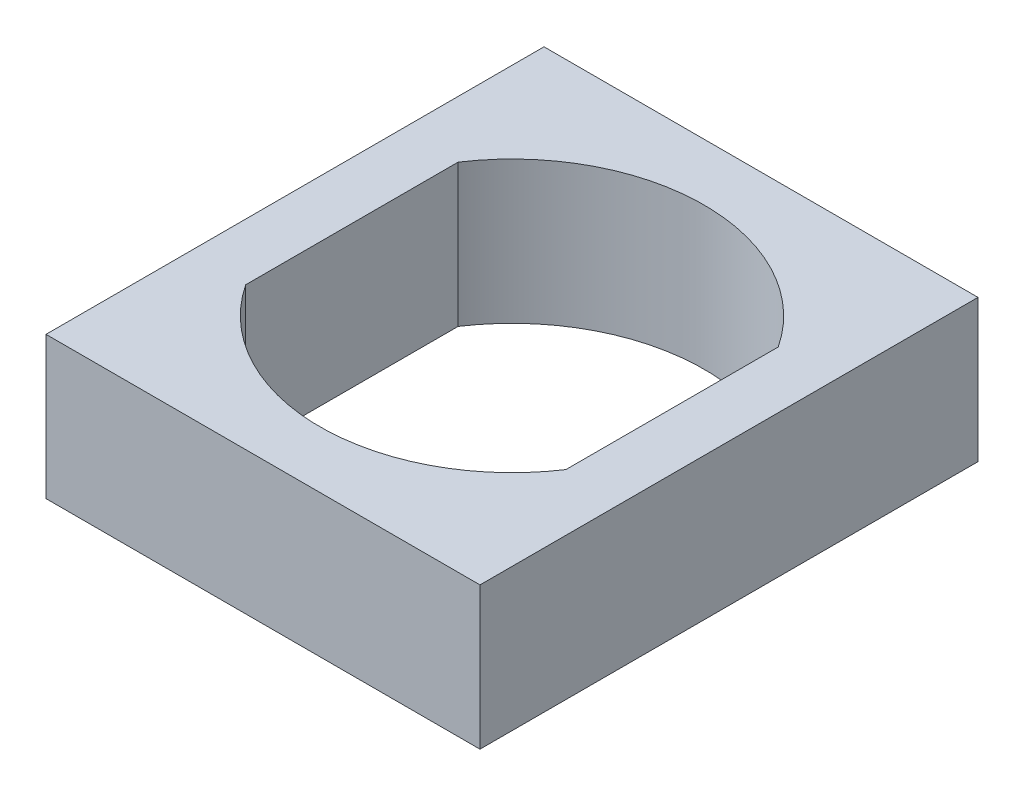
ISO-10303-21;
HEADER;
FILE_DESCRIPTION(('STEP AP214'),'2;1');
FILE_NAME('part.step','',(''),(''),'','','');
FILE_SCHEMA(('AUTOMOTIVE_DESIGN { 1 0 10303 214 1 1 1 1 }'));
ENDSEC;
DATA;
#1=APPLICATION_CONTEXT('core data for automotive mechanical design processes');
#2=APPLICATION_PROTOCOL_DEFINITION('international standard','automotive_design',2000,#1);
#3=PRODUCT_CONTEXT('',#1,'mechanical');
#4=PRODUCT('Part','Part','',(#3));
#5=PRODUCT_RELATED_PRODUCT_CATEGORY('part','',(#4));
#6=PRODUCT_DEFINITION_FORMATION('','',#4);
#7=PRODUCT_DEFINITION_CONTEXT('part definition',#1,'design');
#8=PRODUCT_DEFINITION('design','',#6,#7);
#9=PRODUCT_DEFINITION_SHAPE('','',#8);
#10=(LENGTH_UNIT() NAMED_UNIT(*) SI_UNIT(.MILLI.,.METRE.));
#11=(NAMED_UNIT(*) PLANE_ANGLE_UNIT() SI_UNIT($,.RADIAN.));
#12=(NAMED_UNIT(*) SI_UNIT($,.STERADIAN.) SOLID_ANGLE_UNIT());
#13=UNCERTAINTY_MEASURE_WITH_UNIT(LENGTH_MEASURE(1.E-05),#10,'distance_accuracy_value','');
#14=(GEOMETRIC_REPRESENTATION_CONTEXT(3) GLOBAL_UNCERTAINTY_ASSIGNED_CONTEXT((#13)) GLOBAL_UNIT_ASSIGNED_CONTEXT((#10,
#11,#12)) REPRESENTATION_CONTEXT('',''));
#15=CARTESIAN_POINT('',(0.,0.,0.));
#16=DIRECTION('',(0.,0.,1.));
#17=DIRECTION('',(1.,0.,0.));
#18=AXIS2_PLACEMENT_3D('',#15,#16,#17);
#19=CARTESIAN_POINT('',(0.,45.5089179326912,0.));
#20=DIRECTION('',(0.,-1.,0.));
#21=DIRECTION('',(0.,0.,-1.));
#22=AXIS2_PLACEMENT_3D('',#19,#20,#21);
#23=PLANE('',#22);
#24=DIRECTION('',(0.,0.,1.));
#25=VECTOR('',#24,1.);
#26=CARTESIAN_POINT('',(27.5665676653378,45.5089179326912,72.6258327334639));
#27=LINE('',#26,#25);
#28=CARTESIAN_POINT('',(27.5665676653378,45.5089179326912,65.6258327334642));
#29=VERTEX_POINT('',#28);
#30=CARTESIAN_POINT('',(27.5665676653378,45.5089179326912,72.6258327334639));
#31=VERTEX_POINT('',#30);
#32=EDGE_CURVE('E132',#29,#31,#27,.T.);
#33=ORIENTED_EDGE('',*,*,#32,.F.);
#34=DIRECTION('',(-1.,0.,0.));
#35=VECTOR('',#34,1.);
#36=CARTESIAN_POINT('',(27.5665676653378,45.5089179326912,65.6258327334642));
#37=LINE('',#36,#35);
#38=CARTESIAN_POINT('',(33.6665676653378,45.5089179326912,65.6258327334642));
#39=VERTEX_POINT('',#38);
#40=EDGE_CURVE('E102',#39,#29,#37,.T.);
#41=ORIENTED_EDGE('',*,*,#40,.F.);
#42=DIRECTION('',(0.,0.,-1.));
#43=VECTOR('',#42,1.);
#44=CARTESIAN_POINT('',(33.6665676653378,45.5089179326912,72.6258327334639));
#45=LINE('',#44,#43);
#46=CARTESIAN_POINT('',(33.6665676653378,45.5089179326912,72.6258327334639));
#47=VERTEX_POINT('',#46);
#48=EDGE_CURVE('E126',#47,#39,#45,.T.);
#49=ORIENTED_EDGE('',*,*,#48,.F.);
#50=DIRECTION('',(1.,0.,0.));
#51=VECTOR('',#50,1.);
#52=CARTESIAN_POINT('',(27.5665676653378,45.5089179326912,72.6258327334639));
#53=LINE('',#52,#51);
#54=EDGE_CURVE('E122',#31,#47,#53,.T.);
#55=ORIENTED_EDGE('',*,*,#54,.F.);
#56=EDGE_LOOP('',(#33,#41,#49,#55));
#57=FACE_BOUND('',#56,.T.);
#58=DIRECTION('',(0.,0.,1.));
#59=VECTOR('',#58,1.);
#60=CARTESIAN_POINT('',(28.3665676653378,45.5089179326912,67.6333515778041));
#61=LINE('',#60,#59);
#62=CARTESIAN_POINT('',(28.3665676653378,45.5089179326912,67.6333515778041));
#63=VERTEX_POINT('',#62);
#64=CARTESIAN_POINT('',(28.3665676653378,45.5089179326912,70.618313889124));
#65=VERTEX_POINT('',#64);
#66=EDGE_CURVE('E112',#63,#65,#61,.T.);
#67=ORIENTED_EDGE('',*,*,#66,.T.);
#68=CARTESIAN_POINT('',(30.6165676653378,45.5089179326912,69.125832733464));
#69=DIRECTION('',(0.,1.,0.));
#70=DIRECTION('',(0.,0.,1.));
#71=AXIS2_PLACEMENT_3D('',#68,#69,#70);
#72=CIRCLE('',#71,2.7);
#73=CARTESIAN_POINT('',(32.8665676653378,45.5089179326912,70.618313889124));
#74=VERTEX_POINT('',#73);
#75=EDGE_CURVE('E98',#65,#74,#72,.T.);
#76=ORIENTED_EDGE('',*,*,#75,.T.);
#77=DIRECTION('',(0.,0.,-1.));
#78=VECTOR('',#77,1.);
#79=CARTESIAN_POINT('',(32.8665676653378,45.5089179326912,67.6333515778041));
#80=LINE('',#79,#78);
#81=CARTESIAN_POINT('',(32.8665676653378,45.5089179326912,67.6333515778041));
#82=VERTEX_POINT('',#81);
#83=EDGE_CURVE('E105',#74,#82,#80,.T.);
#84=ORIENTED_EDGE('',*,*,#83,.T.);
#85=CARTESIAN_POINT('',(30.6165676653378,45.5089179326912,69.125832733464));
#86=DIRECTION('',(0.,1.,0.));
#87=DIRECTION('',(0.,0.,1.));
#88=AXIS2_PLACEMENT_3D('',#85,#86,#87);
#89=CIRCLE('',#88,2.7);
#90=EDGE_CURVE('E109',#82,#63,#89,.T.);
#91=ORIENTED_EDGE('',*,*,#90,.T.);
#92=EDGE_LOOP('',(#67,#76,#84,#91));
#93=FACE_BOUND('',#92,.T.);
#94=ADVANCED_FACE('F33',(#57,#93),#23,.T.);
#95=CARTESIAN_POINT('',(27.5665676653378,56.7938519658438,72.6258327334639));
#96=DIRECTION('',(1.,0.,0.));
#97=DIRECTION('',(0.,0.,-1.));
#98=AXIS2_PLACEMENT_3D('',#95,#96,#97);
#99=PLANE('',#98);
#100=DIRECTION('',(0.,-1.,0.));
#101=VECTOR('',#100,1.);
#102=CARTESIAN_POINT('',(27.5665676653378,56.7938519658438,72.6258327334639));
#103=LINE('',#102,#101);
#104=CARTESIAN_POINT('',(27.5665676653378,47.5089179326912,72.6258327334639));
#105=VERTEX_POINT('',#104);
#106=EDGE_CURVE('E120',#105,#31,#103,.T.);
#107=ORIENTED_EDGE('',*,*,#106,.F.);
#108=DIRECTION('',(0.,0.,-1.));
#109=VECTOR('',#108,1.);
#110=CARTESIAN_POINT('',(27.5665676653378,47.5089179326912,72.6258327334639));
#111=LINE('',#110,#109);
#112=CARTESIAN_POINT('',(27.5665676653378,47.5089179326912,65.6258327334642));
#113=VERTEX_POINT('',#112);
#114=EDGE_CURVE('E50',#105,#113,#111,.T.);
#115=ORIENTED_EDGE('',*,*,#114,.T.);
#116=DIRECTION('',(0.,-1.,0.));
#117=VECTOR('',#116,1.);
#118=CARTESIAN_POINT('',(27.5665676653378,56.7938519658438,65.6258327334642));
#119=LINE('',#118,#117);
#120=EDGE_CURVE('E131',#113,#29,#119,.T.);
#121=ORIENTED_EDGE('',*,*,#120,.T.);
#122=ORIENTED_EDGE('',*,*,#32,.T.);
#123=EDGE_LOOP('',(#107,#115,#121,#122));
#124=FACE_BOUND('',#123,.T.);
#125=ADVANCED_FACE('F174',(#124),#99,.F.);
#126=CARTESIAN_POINT('',(27.5665676653378,56.7938519658438,72.6258327334639));
#127=DIRECTION('',(0.,0.,-1.));
#128=DIRECTION('',(-1.,0.,0.));
#129=AXIS2_PLACEMENT_3D('',#126,#127,#128);
#130=PLANE('',#129);
#131=DIRECTION('',(0.,-1.,0.));
#132=VECTOR('',#131,1.);
#133=CARTESIAN_POINT('',(33.6665676653378,56.7938519658438,72.6258327334639));
#134=LINE('',#133,#132);
#135=CARTESIAN_POINT('',(33.6665676653378,47.5089179326912,72.6258327334639));
#136=VERTEX_POINT('',#135);
#137=EDGE_CURVE('E124',#136,#47,#134,.T.);
#138=ORIENTED_EDGE('',*,*,#137,.F.);
#139=DIRECTION('',(-1.,0.,0.));
#140=VECTOR('',#139,1.);
#141=CARTESIAN_POINT('',(27.5665676653378,47.5089179326912,72.6258327334639));
#142=LINE('',#141,#140);
#143=EDGE_CURVE('E123',#136,#105,#142,.T.);
#144=ORIENTED_EDGE('',*,*,#143,.T.);
#145=ORIENTED_EDGE('',*,*,#106,.T.);
#146=ORIENTED_EDGE('',*,*,#54,.T.);
#147=EDGE_LOOP('',(#138,#144,#145,#146));
#148=FACE_BOUND('',#147,.T.);
#149=ADVANCED_FACE('F162',(#148),#130,.F.);
#150=CARTESIAN_POINT('',(33.6665676653378,56.7938519658438,72.6258327334639));
#151=DIRECTION('',(-1.,0.,0.));
#152=DIRECTION('',(0.,0.,1.));
#153=AXIS2_PLACEMENT_3D('',#150,#151,#152);
#154=PLANE('',#153);
#155=DIRECTION('',(0.,-1.,0.));
#156=VECTOR('',#155,1.);
#157=CARTESIAN_POINT('',(33.6665676653378,56.7938519658438,65.6258327334642));
#158=LINE('',#157,#156);
#159=CARTESIAN_POINT('',(33.6665676653378,47.5089179326912,65.6258327334642));
#160=VERTEX_POINT('',#159);
#161=EDGE_CURVE('E128',#160,#39,#158,.T.);
#162=ORIENTED_EDGE('',*,*,#161,.F.);
#163=DIRECTION('',(0.,0.,1.));
#164=VECTOR('',#163,1.);
#165=CARTESIAN_POINT('',(33.6665676653378,47.5089179326912,72.6258327334639));
#166=LINE('',#165,#164);
#167=EDGE_CURVE('E127',#160,#136,#166,.T.);
#168=ORIENTED_EDGE('',*,*,#167,.T.);
#169=ORIENTED_EDGE('',*,*,#137,.T.);
#170=ORIENTED_EDGE('',*,*,#48,.T.);
#171=EDGE_LOOP('',(#162,#168,#169,#170));
#172=FACE_BOUND('',#171,.T.);
#173=ADVANCED_FACE('F167',(#172),#154,.F.);
#174=CARTESIAN_POINT('',(27.5665676653378,56.7938519658438,65.6258327334642));
#175=DIRECTION('',(0.,0.,1.));
#176=DIRECTION('',(1.,0.,0.));
#177=AXIS2_PLACEMENT_3D('',#174,#175,#176);
#178=PLANE('',#177);
#179=ORIENTED_EDGE('',*,*,#120,.F.);
#180=DIRECTION('',(1.,0.,0.));
#181=VECTOR('',#180,1.);
#182=CARTESIAN_POINT('',(27.5665676653378,47.5089179326912,65.6258327334642));
#183=LINE('',#182,#181);
#184=EDGE_CURVE('E130',#113,#160,#183,.T.);
#185=ORIENTED_EDGE('',*,*,#184,.T.);
#186=ORIENTED_EDGE('',*,*,#161,.T.);
#187=ORIENTED_EDGE('',*,*,#40,.T.);
#188=EDGE_LOOP('',(#179,#185,#186,#187));
#189=FACE_BOUND('',#188,.T.);
#190=ADVANCED_FACE('F172',(#189),#178,.F.);
#191=CARTESIAN_POINT('',(30.6165676653378,56.7938519658438,69.125832733464));
#192=DIRECTION('',(0.,-1.,0.));
#193=DIRECTION('',(0.,0.,-1.));
#194=AXIS2_PLACEMENT_3D('',#191,#192,#193);
#195=CYLINDRICAL_SURFACE('',#194,2.7);
#196=CARTESIAN_POINT('',(30.6165676653378,47.5089179326912,69.125832733464));
#197=DIRECTION('',(0.,-1.,0.));
#198=DIRECTION('',(0.,0.,-1.));
#199=AXIS2_PLACEMENT_3D('',#196,#197,#198);
#200=CIRCLE('',#199,2.7);
#201=CARTESIAN_POINT('',(32.8665676653378,47.5089179326912,70.618313889124));
#202=VERTEX_POINT('',#201);
#203=CARTESIAN_POINT('',(28.3665676653378,47.5089179326912,70.618313889124));
#204=VERTEX_POINT('',#203);
#205=EDGE_CURVE('E101',#202,#204,#200,.T.);
#206=ORIENTED_EDGE('',*,*,#205,.F.);
#207=DIRECTION('',(0.,-1.,0.));
#208=VECTOR('',#207,1.);
#209=CARTESIAN_POINT('',(32.8665676653378,56.7938519658438,70.618313889124));
#210=LINE('',#209,#208);
#211=EDGE_CURVE('E94',#202,#74,#210,.T.);
#212=ORIENTED_EDGE('',*,*,#211,.T.);
#213=ORIENTED_EDGE('',*,*,#75,.F.);
#214=DIRECTION('',(0.,-1.,0.));
#215=VECTOR('',#214,1.);
#216=CARTESIAN_POINT('',(28.3665676653378,56.7938519658438,70.618313889124));
#217=LINE('',#216,#215);
#218=EDGE_CURVE('E137',#204,#65,#217,.T.);
#219=ORIENTED_EDGE('',*,*,#218,.F.);
#220=EDGE_LOOP('',(#206,#212,#213,#219));
#221=FACE_BOUND('',#220,.T.);
#222=ADVANCED_FACE('F95',(#221),#195,.F.);
#223=CARTESIAN_POINT('',(32.8665676653378,56.7938519658438,67.6333515778041));
#224=DIRECTION('',(-1.,0.,0.));
#225=DIRECTION('',(0.,0.,1.));
#226=AXIS2_PLACEMENT_3D('',#223,#224,#225);
#227=PLANE('',#226);
#228=DIRECTION('',(0.,0.,1.));
#229=VECTOR('',#228,1.);
#230=CARTESIAN_POINT('',(32.8665676653378,47.5089179326912,67.6333515778041));
#231=LINE('',#230,#229);
#232=CARTESIAN_POINT('',(32.8665676653378,47.5089179326912,67.6333515778041));
#233=VERTEX_POINT('',#232);
#234=EDGE_CURVE('E11',#233,#202,#231,.T.);
#235=ORIENTED_EDGE('',*,*,#234,.F.);
#236=DIRECTION('',(0.,-1.,0.));
#237=VECTOR('',#236,1.);
#238=CARTESIAN_POINT('',(32.8665676653378,56.7938519658438,67.6333515778041));
#239=LINE('',#238,#237);
#240=EDGE_CURVE('E87',#233,#82,#239,.T.);
#241=ORIENTED_EDGE('',*,*,#240,.T.);
#242=ORIENTED_EDGE('',*,*,#83,.F.);
#243=ORIENTED_EDGE('',*,*,#211,.F.);
#244=EDGE_LOOP('',(#235,#241,#242,#243));
#245=FACE_BOUND('',#244,.T.);
#246=ADVANCED_FACE('F106',(#245),#227,.T.);
#247=CARTESIAN_POINT('',(30.6165676653378,56.7938519658438,69.125832733464));
#248=DIRECTION('',(0.,-1.,0.));
#249=DIRECTION('',(0.,0.,-1.));
#250=AXIS2_PLACEMENT_3D('',#247,#248,#249);
#251=CYLINDRICAL_SURFACE('',#250,2.7);
#252=CARTESIAN_POINT('',(30.6165676653378,47.5089179326912,69.125832733464));
#253=DIRECTION('',(0.,-1.,0.));
#254=DIRECTION('',(0.,0.,-1.));
#255=AXIS2_PLACEMENT_3D('',#252,#253,#254);
#256=CIRCLE('',#255,2.7);
#257=CARTESIAN_POINT('',(28.3665676653378,47.5089179326912,67.6333515778041));
#258=VERTEX_POINT('',#257);
#259=EDGE_CURVE('E37',#258,#233,#256,.T.);
#260=ORIENTED_EDGE('',*,*,#259,.F.);
#261=DIRECTION('',(0.,-1.,0.));
#262=VECTOR('',#261,1.);
#263=CARTESIAN_POINT('',(28.3665676653378,56.7938519658438,67.6333515778041));
#264=LINE('',#263,#262);
#265=EDGE_CURVE('E135',#258,#63,#264,.T.);
#266=ORIENTED_EDGE('',*,*,#265,.T.);
#267=ORIENTED_EDGE('',*,*,#90,.F.);
#268=ORIENTED_EDGE('',*,*,#240,.F.);
#269=EDGE_LOOP('',(#260,#266,#267,#268));
#270=FACE_BOUND('',#269,.T.);
#271=ADVANCED_FACE('F155',(#270),#251,.F.);
#272=CARTESIAN_POINT('',(28.3665676653378,56.7938519658438,67.6333515778041));
#273=DIRECTION('',(1.,0.,0.));
#274=DIRECTION('',(0.,0.,-1.));
#275=AXIS2_PLACEMENT_3D('',#272,#273,#274);
#276=PLANE('',#275);
#277=DIRECTION('',(0.,0.,-1.));
#278=VECTOR('',#277,1.);
#279=CARTESIAN_POINT('',(28.3665676653378,47.5089179326912,67.6333515778041));
#280=LINE('',#279,#278);
#281=EDGE_CURVE('E117',#204,#258,#280,.T.);
#282=ORIENTED_EDGE('',*,*,#281,.F.);
#283=ORIENTED_EDGE('',*,*,#218,.T.);
#284=ORIENTED_EDGE('',*,*,#66,.F.);
#285=ORIENTED_EDGE('',*,*,#265,.F.);
#286=EDGE_LOOP('',(#282,#283,#284,#285));
#287=FACE_BOUND('',#286,.T.);
#288=ADVANCED_FACE('F152',(#287),#276,.T.);
#289=CARTESIAN_POINT('',(35.7665676653382,47.5089179326912,69.125832733464));
#290=DIRECTION('',(0.,-1.,0.));
#291=DIRECTION('',(-1.,0.,0.));
#292=AXIS2_PLACEMENT_3D('',#289,#290,#291);
#293=PLANE('',#292);
#294=ORIENTED_EDGE('',*,*,#205,.T.);
#295=ORIENTED_EDGE('',*,*,#281,.T.);
#296=ORIENTED_EDGE('',*,*,#259,.T.);
#297=ORIENTED_EDGE('',*,*,#234,.T.);
#298=EDGE_LOOP('',(#294,#295,#296,#297));
#299=FACE_BOUND('',#298,.T.);
#300=ORIENTED_EDGE('',*,*,#143,.F.);
#301=ORIENTED_EDGE('',*,*,#167,.F.);
#302=ORIENTED_EDGE('',*,*,#184,.F.);
#303=ORIENTED_EDGE('',*,*,#114,.F.);
#304=EDGE_LOOP('',(#300,#301,#302,#303));
#305=FACE_BOUND('',#304,.T.);
#306=ADVANCED_FACE('F35',(#299,#305),#293,.F.);
#307=CLOSED_SHELL('',(#94,#125,#149,#173,#190,#222,#246,#271,#288,#306));
#308=MANIFOLD_SOLID_BREP('B2',#307);
#309=ADVANCED_BREP_SHAPE_REPRESENTATION('',(#18,#308),#14);
#310=SHAPE_DEFINITION_REPRESENTATION(#9,#309);
ENDSEC;
END-ISO-10303-21;
